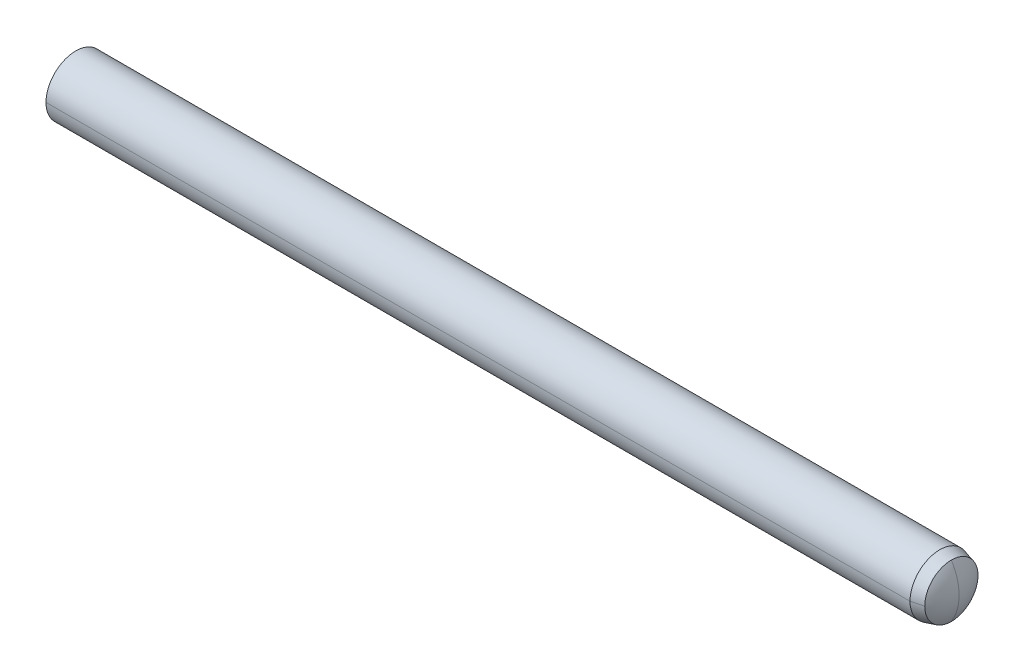
ISO-10303-21;
HEADER;
FILE_DESCRIPTION(('STEP AP214'),'2;1');
FILE_NAME('part.step','',(''),(''),'','','');
FILE_SCHEMA(('AUTOMOTIVE_DESIGN { 1 0 10303 214 1 1 1 1 }'));
ENDSEC;
DATA;
#1=APPLICATION_CONTEXT('core data for automotive mechanical design processes');
#2=APPLICATION_PROTOCOL_DEFINITION('international standard','automotive_design',2000,#1);
#3=PRODUCT_CONTEXT('',#1,'mechanical');
#4=PRODUCT('Part','Part','',(#3));
#5=PRODUCT_RELATED_PRODUCT_CATEGORY('part','',(#4));
#6=PRODUCT_DEFINITION_FORMATION('','',#4);
#7=PRODUCT_DEFINITION_CONTEXT('part definition',#1,'design');
#8=PRODUCT_DEFINITION('design','',#6,#7);
#9=PRODUCT_DEFINITION_SHAPE('','',#8);
#10=(LENGTH_UNIT() NAMED_UNIT(*) SI_UNIT(.MILLI.,.METRE.));
#11=(NAMED_UNIT(*) PLANE_ANGLE_UNIT() SI_UNIT($,.RADIAN.));
#12=(NAMED_UNIT(*) SI_UNIT($,.STERADIAN.) SOLID_ANGLE_UNIT());
#13=UNCERTAINTY_MEASURE_WITH_UNIT(LENGTH_MEASURE(1.E-05),#10,'distance_accuracy_value','');
#14=(GEOMETRIC_REPRESENTATION_CONTEXT(3) GLOBAL_UNCERTAINTY_ASSIGNED_CONTEXT((#13)) GLOBAL_UNIT_ASSIGNED_CONTEXT((#10,
#11,#12)) REPRESENTATION_CONTEXT('',''));
#15=CARTESIAN_POINT('',(0.,0.,0.));
#16=DIRECTION('',(0.,0.,1.));
#17=DIRECTION('',(1.,0.,0.));
#18=AXIS2_PLACEMENT_3D('',#15,#16,#17);
#19=CARTESIAN_POINT('',(-19.775,0.,0.));
#20=DIRECTION('',(0.,0.,1.));
#21=DIRECTION('',(0.,-1.,0.));
#22=AXIS2_PLACEMENT_3D('',#19,#20,#21);
#23=SPHERICAL_SURFACE('',#22,2.725);
#24=CARTESIAN_POINT('',(-22.05,0.,0.));
#25=DIRECTION('',(-1.,0.,0.));
#26=DIRECTION('',(0.,0.,1.));
#27=AXIS2_PLACEMENT_3D('',#24,#25,#26);
#28=CIRCLE('',#27,1.5);
#29=CARTESIAN_POINT('',(-22.05,0.,1.5));
#30=VERTEX_POINT('',#29);
#31=CARTESIAN_POINT('',(-22.05,1.5,0.));
#32=VERTEX_POINT('',#31);
#33=EDGE_CURVE('E11',#30,#32,#28,.T.);
#34=ORIENTED_EDGE('',*,*,#33,.T.);
#35=CARTESIAN_POINT('',(-19.775,0.,0.));
#36=DIRECTION('',(0.,0.,1.));
#37=DIRECTION('',(0.,-1.,0.));
#38=AXIS2_PLACEMENT_3D('',#35,#36,#37);
#39=CIRCLE('',#38,2.725);
#40=CARTESIAN_POINT('',(-22.5,0.,0.));
#41=VERTEX_POINT('',#40);
#42=EDGE_CURVE('E27',#32,#41,#39,.T.);
#43=ORIENTED_EDGE('',*,*,#42,.T.);
#44=CARTESIAN_POINT('',(-19.775,0.,0.));
#45=DIRECTION('',(0.,0.,-1.));
#46=DIRECTION('',(-1.,0.,0.));
#47=AXIS2_PLACEMENT_3D('',#44,#45,#46);
#48=CIRCLE('',#47,2.725);
#49=CARTESIAN_POINT('',(-22.05,-1.5,0.));
#50=VERTEX_POINT('',#49);
#51=EDGE_CURVE('E76',#50,#41,#48,.T.);
#52=ORIENTED_EDGE('',*,*,#51,.F.);
#53=CARTESIAN_POINT('',(-22.05,0.,0.));
#54=DIRECTION('',(-1.,0.,0.));
#55=DIRECTION('',(0.,0.,1.));
#56=AXIS2_PLACEMENT_3D('',#53,#54,#55);
#57=CIRCLE('',#56,1.5);
#58=EDGE_CURVE('E78',#50,#30,#57,.T.);
#59=ORIENTED_EDGE('',*,*,#58,.T.);
#60=EDGE_LOOP('',(#34,#43,#52,#59));
#61=FACE_BOUND('',#60,.T.);
#62=ADVANCED_FACE('F16',(#61),#23,.T.);
#63=CARTESIAN_POINT('',(19.991769465638,0.,0.));
#64=DIRECTION('',(0.,0.,-1.));
#65=DIRECTION('',(0.,1.,0.));
#66=AXIS2_PLACEMENT_3D('',#63,#64,#65);
#67=SPHERICAL_SURFACE('',#66,2.50823053436193);
#68=CARTESIAN_POINT('',(19.991769465638,0.,0.));
#69=DIRECTION('',(0.,0.,1.));
#70=DIRECTION('',(1.,0.,0.));
#71=AXIS2_PLACEMENT_3D('',#68,#69,#70);
#72=CIRCLE('',#71,2.50823053436193);
#73=CARTESIAN_POINT('',(22.5,0.,0.));
#74=VERTEX_POINT('',#73);
#75=CARTESIAN_POINT('',(22.11,1.34324972242779,0.));
#76=VERTEX_POINT('',#75);
#77=EDGE_CURVE('E102',#74,#76,#72,.T.);
#78=ORIENTED_EDGE('',*,*,#77,.F.);
#79=CARTESIAN_POINT('',(19.991769465638,0.,0.));
#80=DIRECTION('',(0.,0.,-1.));
#81=DIRECTION('',(0.,1.,0.));
#82=AXIS2_PLACEMENT_3D('',#79,#80,#81);
#83=CIRCLE('',#82,2.50823053436193);
#84=CARTESIAN_POINT('',(22.11,-1.34324972242779,0.));
#85=VERTEX_POINT('',#84);
#86=EDGE_CURVE('E20',#74,#85,#83,.T.);
#87=ORIENTED_EDGE('',*,*,#86,.T.);
#88=CARTESIAN_POINT('',(22.11,0.,0.));
#89=DIRECTION('',(-1.,0.,0.));
#90=DIRECTION('',(0.,0.,1.));
#91=AXIS2_PLACEMENT_3D('',#88,#89,#90);
#92=CIRCLE('',#91,1.34324972242779);
#93=CARTESIAN_POINT('',(22.11,0.,-1.34324972242779));
#94=VERTEX_POINT('',#93);
#95=EDGE_CURVE('E105',#94,#85,#92,.T.);
#96=ORIENTED_EDGE('',*,*,#95,.F.);
#97=CARTESIAN_POINT('',(22.11,0.,0.));
#98=DIRECTION('',(-1.,0.,0.));
#99=DIRECTION('',(0.,0.,1.));
#100=AXIS2_PLACEMENT_3D('',#97,#98,#99);
#101=CIRCLE('',#100,1.34324972242779);
#102=EDGE_CURVE('E127',#76,#94,#101,.T.);
#103=ORIENTED_EDGE('',*,*,#102,.F.);
#104=EDGE_LOOP('',(#78,#87,#96,#103));
#105=FACE_BOUND('',#104,.T.);
#106=ADVANCED_FACE('F18',(#105),#67,.T.);
#107=CARTESIAN_POINT('',(21.525,0.,0.));
#108=DIRECTION('',(-1.,0.,0.));
#109=DIRECTION('',(0.,0.,1.));
#110=AXIS2_PLACEMENT_3D('',#107,#108,#109);
#111=CONICAL_SURFACE('',#110,1.5,0.261799387799153);
#112=CARTESIAN_POINT('',(22.11,0.,0.));
#113=DIRECTION('',(-1.,0.,0.));
#114=DIRECTION('',(0.,0.,1.));
#115=AXIS2_PLACEMENT_3D('',#112,#113,#114);
#116=CIRCLE('',#115,1.34324972242779);
#117=CARTESIAN_POINT('',(22.11,0.,1.34324972242779));
#118=VERTEX_POINT('',#117);
#119=EDGE_CURVE('E131',#118,#76,#116,.T.);
#120=ORIENTED_EDGE('',*,*,#119,.T.);
#121=ORIENTED_EDGE('',*,*,#102,.T.);
#122=DIRECTION('',(-0.965925826289067,0.,-0.258819045102524));
#123=VECTOR('',#122,1.);
#124=CARTESIAN_POINT('',(21.525,0.,-1.5));
#125=LINE('',#124,#123);
#126=CARTESIAN_POINT('',(21.525,0.,-1.5));
#127=VERTEX_POINT('',#126);
#128=EDGE_CURVE('E132',#94,#127,#125,.T.);
#129=ORIENTED_EDGE('',*,*,#128,.T.);
#130=CARTESIAN_POINT('',(21.525,0.,0.));
#131=DIRECTION('',(-1.,0.,0.));
#132=DIRECTION('',(0.,0.,1.));
#133=AXIS2_PLACEMENT_3D('',#130,#131,#132);
#134=CIRCLE('',#133,1.5);
#135=CARTESIAN_POINT('',(21.525,0.,1.5));
#136=VERTEX_POINT('',#135);
#137=EDGE_CURVE('E117',#136,#127,#134,.T.);
#138=ORIENTED_EDGE('',*,*,#137,.F.);
#139=DIRECTION('',(-0.965925826289067,0.,0.258819045102524));
#140=VECTOR('',#139,1.);
#141=CARTESIAN_POINT('',(21.525,0.,1.5));
#142=LINE('',#141,#140);
#143=EDGE_CURVE('E121',#118,#136,#142,.T.);
#144=ORIENTED_EDGE('',*,*,#143,.F.);
#145=EDGE_LOOP('',(#120,#121,#129,#138,#144));
#146=FACE_BOUND('',#145,.T.);
#147=ADVANCED_FACE('F152',(#146),#111,.T.);
#148=CARTESIAN_POINT('',(-22.5,0.,0.));
#149=DIRECTION('',(1.,0.,0.));
#150=DIRECTION('',(0.,0.,-1.));
#151=AXIS2_PLACEMENT_3D('',#148,#149,#150);
#152=CYLINDRICAL_SURFACE('',#151,1.5);
#153=ORIENTED_EDGE('',*,*,#33,.F.);
#154=DIRECTION('',(1.,0.,0.));
#155=VECTOR('',#154,1.);
#156=CARTESIAN_POINT('',(-22.5,0.,1.5));
#157=LINE('',#156,#155);
#158=EDGE_CURVE('E90',#30,#136,#157,.T.);
#159=ORIENTED_EDGE('',*,*,#158,.T.);
#160=ORIENTED_EDGE('',*,*,#137,.T.);
#161=DIRECTION('',(1.,0.,0.));
#162=VECTOR('',#161,1.);
#163=CARTESIAN_POINT('',(-22.5,0.,-1.5));
#164=LINE('',#163,#162);
#165=CARTESIAN_POINT('',(-22.05,0.,-1.5));
#166=VERTEX_POINT('',#165);
#167=EDGE_CURVE('E112',#166,#127,#164,.T.);
#168=ORIENTED_EDGE('',*,*,#167,.F.);
#169=CARTESIAN_POINT('',(-22.05,0.,0.));
#170=DIRECTION('',(-1.,0.,0.));
#171=DIRECTION('',(0.,0.,1.));
#172=AXIS2_PLACEMENT_3D('',#169,#170,#171);
#173=CIRCLE('',#172,1.5);
#174=EDGE_CURVE('E95',#32,#166,#173,.T.);
#175=ORIENTED_EDGE('',*,*,#174,.F.);
#176=EDGE_LOOP('',(#153,#159,#160,#168,#175));
#177=FACE_BOUND('',#176,.T.);
#178=ADVANCED_FACE('F147',(#177),#152,.T.);
#179=CARTESIAN_POINT('',(-22.5,0.,0.));
#180=DIRECTION('',(1.,0.,0.));
#181=DIRECTION('',(0.,0.,-1.));
#182=AXIS2_PLACEMENT_3D('',#179,#180,#181);
#183=CYLINDRICAL_SURFACE('',#182,1.5);
#184=ORIENTED_EDGE('',*,*,#158,.F.);
#185=ORIENTED_EDGE('',*,*,#58,.F.);
#186=CARTESIAN_POINT('',(-22.05,0.,0.));
#187=DIRECTION('',(-1.,0.,0.));
#188=DIRECTION('',(0.,0.,1.));
#189=AXIS2_PLACEMENT_3D('',#186,#187,#188);
#190=CIRCLE('',#189,1.5);
#191=EDGE_CURVE('E82',#166,#50,#190,.T.);
#192=ORIENTED_EDGE('',*,*,#191,.F.);
#193=ORIENTED_EDGE('',*,*,#167,.T.);
#194=CARTESIAN_POINT('',(21.525,0.,0.));
#195=DIRECTION('',(-1.,0.,0.));
#196=DIRECTION('',(0.,0.,1.));
#197=AXIS2_PLACEMENT_3D('',#194,#195,#196);
#198=CIRCLE('',#197,1.5);
#199=EDGE_CURVE('E107',#127,#136,#198,.T.);
#200=ORIENTED_EDGE('',*,*,#199,.T.);
#201=EDGE_LOOP('',(#184,#185,#192,#193,#200));
#202=FACE_BOUND('',#201,.T.);
#203=ADVANCED_FACE('F87',(#202),#183,.T.);
#204=CARTESIAN_POINT('',(21.525,0.,0.));
#205=DIRECTION('',(-1.,0.,0.));
#206=DIRECTION('',(0.,0.,1.));
#207=AXIS2_PLACEMENT_3D('',#204,#205,#206);
#208=CONICAL_SURFACE('',#207,1.5,0.261799387799153);
#209=ORIENTED_EDGE('',*,*,#128,.F.);
#210=ORIENTED_EDGE('',*,*,#95,.T.);
#211=CARTESIAN_POINT('',(22.11,0.,0.));
#212=DIRECTION('',(-1.,0.,0.));
#213=DIRECTION('',(0.,0.,1.));
#214=AXIS2_PLACEMENT_3D('',#211,#212,#213);
#215=CIRCLE('',#214,1.34324972242779);
#216=EDGE_CURVE('E108',#85,#118,#215,.T.);
#217=ORIENTED_EDGE('',*,*,#216,.T.);
#218=ORIENTED_EDGE('',*,*,#143,.T.);
#219=ORIENTED_EDGE('',*,*,#199,.F.);
#220=EDGE_LOOP('',(#209,#210,#217,#218,#219));
#221=FACE_BOUND('',#220,.T.);
#222=ADVANCED_FACE('F155',(#221),#208,.T.);
#223=CARTESIAN_POINT('',(19.991769465638,0.,0.));
#224=DIRECTION('',(0.,0.,-1.));
#225=DIRECTION('',(0.,1.,0.));
#226=AXIS2_PLACEMENT_3D('',#223,#224,#225);
#227=SPHERICAL_SURFACE('',#226,2.50823053436193);
#228=ORIENTED_EDGE('',*,*,#86,.F.);
#229=ORIENTED_EDGE('',*,*,#77,.T.);
#230=ORIENTED_EDGE('',*,*,#119,.F.);
#231=ORIENTED_EDGE('',*,*,#216,.F.);
#232=EDGE_LOOP('',(#228,#229,#230,#231));
#233=FACE_BOUND('',#232,.T.);
#234=ADVANCED_FACE('F167',(#233),#227,.T.);
#235=CARTESIAN_POINT('',(-19.775,0.,0.));
#236=DIRECTION('',(0.,0.,1.));
#237=DIRECTION('',(0.,-1.,0.));
#238=AXIS2_PLACEMENT_3D('',#235,#236,#237);
#239=SPHERICAL_SURFACE('',#238,2.725);
#240=ORIENTED_EDGE('',*,*,#42,.F.);
#241=ORIENTED_EDGE('',*,*,#174,.T.);
#242=ORIENTED_EDGE('',*,*,#191,.T.);
#243=ORIENTED_EDGE('',*,*,#51,.T.);
#244=EDGE_LOOP('',(#240,#241,#242,#243));
#245=FACE_BOUND('',#244,.T.);
#246=ADVANCED_FACE('F93',(#245),#239,.T.);
#247=CLOSED_SHELL('',(#62,#106,#147,#178,#203,#222,#234,#246));
#248=MANIFOLD_SOLID_BREP('B1',#247);
#249=ADVANCED_BREP_SHAPE_REPRESENTATION('',(#18,#248),#14);
#250=SHAPE_DEFINITION_REPRESENTATION(#9,#249);
ENDSEC;
END-ISO-10303-21;
